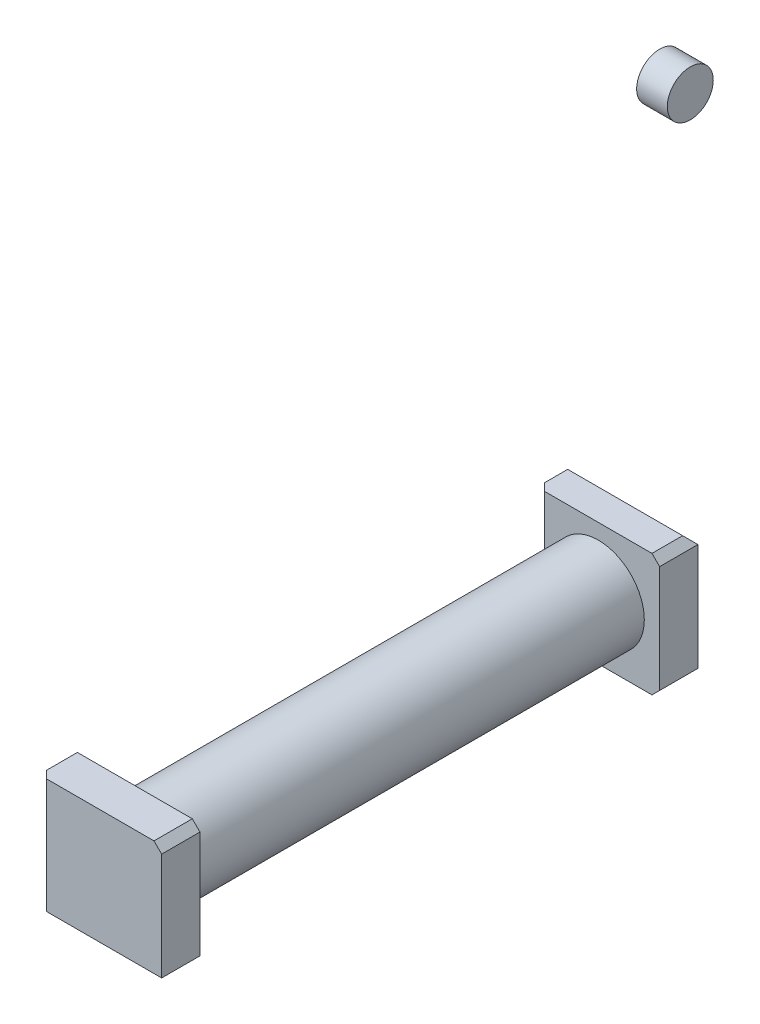
ISO-10303-21;
HEADER;
FILE_DESCRIPTION(('STEP AP214'),'2;1');
FILE_NAME('part.step','',(''),(''),'','','');
FILE_SCHEMA(('AUTOMOTIVE_DESIGN { 1 0 10303 214 1 1 1 1 }'));
ENDSEC;
DATA;
#1=APPLICATION_CONTEXT('core data for automotive mechanical design processes');
#2=APPLICATION_PROTOCOL_DEFINITION('international standard','automotive_design',2000,#1);
#3=PRODUCT_CONTEXT('',#1,'mechanical');
#4=PRODUCT('Part','Part','',(#3));
#5=PRODUCT_RELATED_PRODUCT_CATEGORY('part','',(#4));
#6=PRODUCT_DEFINITION_FORMATION('','',#4);
#7=PRODUCT_DEFINITION_CONTEXT('part definition',#1,'design');
#8=PRODUCT_DEFINITION('design','',#6,#7);
#9=PRODUCT_DEFINITION_SHAPE('','',#8);
#10=(LENGTH_UNIT() NAMED_UNIT(*) SI_UNIT(.MILLI.,.METRE.));
#11=(NAMED_UNIT(*) PLANE_ANGLE_UNIT() SI_UNIT($,.RADIAN.));
#12=(NAMED_UNIT(*) SI_UNIT($,.STERADIAN.) SOLID_ANGLE_UNIT());
#13=UNCERTAINTY_MEASURE_WITH_UNIT(LENGTH_MEASURE(1.E-05),#10,'distance_accuracy_value','');
#14=(GEOMETRIC_REPRESENTATION_CONTEXT(3) GLOBAL_UNCERTAINTY_ASSIGNED_CONTEXT((#13)) GLOBAL_UNIT_ASSIGNED_CONTEXT((#10,
#11,#12)) REPRESENTATION_CONTEXT('',''));
#15=CARTESIAN_POINT('',(0.,0.,0.));
#16=DIRECTION('',(0.,0.,1.));
#17=DIRECTION('',(1.,0.,0.));
#18=AXIS2_PLACEMENT_3D('',#15,#16,#17);
#19=CARTESIAN_POINT('',(60.,312.5,0.));
#20=DIRECTION('',(-1.,0.,0.));
#21=DIRECTION('',(0.,0.,1.));
#22=AXIS2_PLACEMENT_3D('',#19,#20,#21);
#23=CYLINDRICAL_SURFACE('',#22,15.);
#24=CARTESIAN_POINT('',(60.,312.5,0.));
#25=DIRECTION('',(1.,0.,0.));
#26=DIRECTION('',(0.,0.,-1.));
#27=AXIS2_PLACEMENT_3D('',#24,#25,#26);
#28=CIRCLE('',#27,15.);
#29=CARTESIAN_POINT('',(60.,312.5,-15.));
#30=VERTEX_POINT('',#29);
#31=EDGE_CURVE('E11',#30,#30,#28,.T.);
#32=ORIENTED_EDGE('',*,*,#31,.F.);
#33=EDGE_LOOP('',(#32));
#34=FACE_BOUND('',#33,.T.);
#35=CARTESIAN_POINT('',(40.,312.5,0.));
#36=DIRECTION('',(1.,0.,0.));
#37=DIRECTION('',(0.,0.,-1.));
#38=AXIS2_PLACEMENT_3D('',#35,#36,#37);
#39=CIRCLE('',#38,15.);
#40=CARTESIAN_POINT('',(40.,312.5,-15.));
#41=VERTEX_POINT('',#40);
#42=EDGE_CURVE('E55',#41,#41,#39,.T.);
#43=ORIENTED_EDGE('',*,*,#42,.T.);
#44=EDGE_LOOP('',(#43));
#45=FACE_BOUND('',#44,.T.);
#46=ADVANCED_FACE('F47',(#34,#45),#23,.T.);
#47=CARTESIAN_POINT('',(60.,312.5,0.));
#48=DIRECTION('',(1.,0.,0.));
#49=DIRECTION('',(0.,0.,-1.));
#50=AXIS2_PLACEMENT_3D('',#47,#48,#49);
#51=PLANE('',#50);
#52=ORIENTED_EDGE('',*,*,#31,.T.);
#53=EDGE_LOOP('',(#52));
#54=FACE_BOUND('',#53,.T.);
#55=ADVANCED_FACE('F63',(#54),#51,.T.);
#56=CARTESIAN_POINT('',(40.,312.5,0.));
#57=DIRECTION('',(1.,0.,0.));
#58=DIRECTION('',(0.,0.,-1.));
#59=AXIS2_PLACEMENT_3D('',#56,#57,#58);
#60=PLANE('',#59);
#61=ORIENTED_EDGE('',*,*,#42,.F.);
#62=EDGE_LOOP('',(#61));
#63=FACE_BOUND('',#62,.T.);
#64=ADVANCED_FACE('F62',(#63),#60,.F.);
#65=CLOSED_SHELL('',(#46,#55,#64));
#66=MANIFOLD_SOLID_BREP('B2',#65);
#67=CARTESIAN_POINT('',(0.,0.,300.));
#68=DIRECTION('',(0.,0.,-1.));
#69=DIRECTION('',(-1.,0.,0.));
#70=AXIS2_PLACEMENT_3D('',#67,#68,#69);
#71=CYLINDRICAL_SURFACE('',#70,30.);
#72=CARTESIAN_POINT('',(0.,0.,300.));
#73=DIRECTION('',(0.,0.,1.));
#74=DIRECTION('',(1.,0.,0.));
#75=AXIS2_PLACEMENT_3D('',#72,#73,#74);
#76=CIRCLE('',#75,30.);
#77=CARTESIAN_POINT('',(30.,0.,300.));
#78=VERTEX_POINT('',#77);
#79=EDGE_CURVE('E255',#78,#78,#76,.T.);
#80=ORIENTED_EDGE('',*,*,#79,.F.);
#81=EDGE_LOOP('',(#80));
#82=FACE_BOUND('',#81,.T.);
#83=CARTESIAN_POINT('',(0.,0.,0.));
#84=DIRECTION('',(0.,0.,1.));
#85=DIRECTION('',(1.,0.,0.));
#86=AXIS2_PLACEMENT_3D('',#83,#84,#85);
#87=CIRCLE('',#86,30.);
#88=CARTESIAN_POINT('',(30.,0.,0.));
#89=VERTEX_POINT('',#88);
#90=EDGE_CURVE('E253',#89,#89,#87,.T.);
#91=ORIENTED_EDGE('',*,*,#90,.T.);
#92=EDGE_LOOP('',(#91));
#93=FACE_BOUND('',#92,.T.);
#94=ADVANCED_FACE('F89',(#82,#93),#71,.T.);
#95=CARTESIAN_POINT('',(40.,-40.,-25.));
#96=DIRECTION('',(1.,0.,0.));
#97=DIRECTION('',(0.,0.,-1.));
#98=AXIS2_PLACEMENT_3D('',#95,#96,#97);
#99=PLANE('',#98);
#100=DIRECTION('',(0.,1.,0.));
#101=VECTOR('',#100,1.);
#102=CARTESIAN_POINT('',(40.,-40.,0.));
#103=LINE('',#102,#101);
#104=CARTESIAN_POINT('',(40.,-35.,0.));
#105=VERTEX_POINT('',#104);
#106=CARTESIAN_POINT('',(40.,35.0000000000001,0.));
#107=VERTEX_POINT('',#106);
#108=EDGE_CURVE('E238',#105,#107,#103,.T.);
#109=ORIENTED_EDGE('',*,*,#108,.F.);
#110=DIRECTION('',(0.,0.,-1.));
#111=VECTOR('',#110,1.);
#112=CARTESIAN_POINT('',(40.,-35.,-25.));
#113=LINE('',#112,#111);
#114=CARTESIAN_POINT('',(40.,-35.,-25.));
#115=VERTEX_POINT('',#114);
#116=EDGE_CURVE('E274',#105,#115,#113,.T.);
#117=ORIENTED_EDGE('',*,*,#116,.T.);
#118=DIRECTION('',(0.,1.,0.));
#119=VECTOR('',#118,1.);
#120=CARTESIAN_POINT('',(40.,-40.,-25.));
#121=LINE('',#120,#119);
#122=CARTESIAN_POINT('',(40.,35.0000000000001,-25.));
#123=VERTEX_POINT('',#122);
#124=EDGE_CURVE('E230',#115,#123,#121,.T.);
#125=ORIENTED_EDGE('',*,*,#124,.T.);
#126=DIRECTION('',(0.,0.,1.));
#127=VECTOR('',#126,1.);
#128=CARTESIAN_POINT('',(40.,35.0000000000001,-25.));
#129=LINE('',#128,#127);
#130=EDGE_CURVE('E272',#123,#107,#129,.T.);
#131=ORIENTED_EDGE('',*,*,#130,.T.);
#132=EDGE_LOOP('',(#109,#117,#125,#131));
#133=FACE_BOUND('',#132,.T.);
#134=ADVANCED_FACE('F343',(#133),#99,.T.);
#135=CARTESIAN_POINT('',(-40.,-40.,-25.));
#136=DIRECTION('',(0.,-1.,0.));
#137=DIRECTION('',(0.,0.,-1.));
#138=AXIS2_PLACEMENT_3D('',#135,#136,#137);
#139=PLANE('',#138);
#140=DIRECTION('',(1.,0.,0.));
#141=VECTOR('',#140,1.);
#142=CARTESIAN_POINT('',(-40.,-40.,-25.));
#143=LINE('',#142,#141);
#144=CARTESIAN_POINT('',(-40.,-40.,-25.));
#145=VERTEX_POINT('',#144);
#146=CARTESIAN_POINT('',(35.0000000000001,-40.,-25.));
#147=VERTEX_POINT('',#146);
#148=EDGE_CURVE('E237',#145,#147,#143,.T.);
#149=ORIENTED_EDGE('',*,*,#148,.T.);
#150=DIRECTION('',(0.,0.,1.));
#151=VECTOR('',#150,1.);
#152=CARTESIAN_POINT('',(35.0000000000001,-40.,-25.));
#153=LINE('',#152,#151);
#154=CARTESIAN_POINT('',(35.0000000000001,-40.,0.));
#155=VERTEX_POINT('',#154);
#156=EDGE_CURVE('E263',#147,#155,#153,.T.);
#157=ORIENTED_EDGE('',*,*,#156,.T.);
#158=DIRECTION('',(1.,0.,0.));
#159=VECTOR('',#158,1.);
#160=CARTESIAN_POINT('',(-40.,-40.,0.));
#161=LINE('',#160,#159);
#162=CARTESIAN_POINT('',(-35.0000000000001,-40.,0.));
#163=VERTEX_POINT('',#162);
#164=EDGE_CURVE('E231',#163,#155,#161,.T.);
#165=ORIENTED_EDGE('',*,*,#164,.F.);
#166=DIRECTION('',(-0.70710678118654,0.,-0.707106781186555));
#167=VECTOR('',#166,1.);
#168=CARTESIAN_POINT('',(-50.,-40.,-15.0000000000002));
#169=LINE('',#168,#167);
#170=CARTESIAN_POINT('',(-40.,-40.,-5.));
#171=VERTEX_POINT('',#170);
#172=EDGE_CURVE('E260',#163,#171,#169,.T.);
#173=ORIENTED_EDGE('',*,*,#172,.T.);
#174=DIRECTION('',(0.,0.,1.));
#175=VECTOR('',#174,1.);
#176=CARTESIAN_POINT('',(-40.,-40.,-25.));
#177=LINE('',#176,#175);
#178=EDGE_CURVE('E249',#145,#171,#177,.T.);
#179=ORIENTED_EDGE('',*,*,#178,.F.);
#180=EDGE_LOOP('',(#149,#157,#165,#173,#179));
#181=FACE_BOUND('',#180,.T.);
#182=ADVANCED_FACE('F352',(#181),#139,.T.);
#183=CARTESIAN_POINT('',(-40.,-40.,-25.));
#184=DIRECTION('',(-1.,0.,0.));
#185=DIRECTION('',(0.,0.,1.));
#186=AXIS2_PLACEMENT_3D('',#183,#184,#185);
#187=PLANE('',#186);
#188=ORIENTED_EDGE('',*,*,#178,.T.);
#189=DIRECTION('',(0.,1.,0.));
#190=VECTOR('',#189,1.);
#191=CARTESIAN_POINT('',(-40.,40.,-5.));
#192=LINE('',#191,#190);
#193=CARTESIAN_POINT('',(-40.,40.,-5.));
#194=VERTEX_POINT('',#193);
#195=EDGE_CURVE('E284',#171,#194,#192,.T.);
#196=ORIENTED_EDGE('',*,*,#195,.T.);
#197=DIRECTION('',(0.,0.,1.));
#198=VECTOR('',#197,1.);
#199=CARTESIAN_POINT('',(-40.,40.,-25.));
#200=LINE('',#199,#198);
#201=CARTESIAN_POINT('',(-40.,40.,-20.));
#202=VERTEX_POINT('',#201);
#203=EDGE_CURVE('E239',#202,#194,#200,.T.);
#204=ORIENTED_EDGE('',*,*,#203,.F.);
#205=DIRECTION('',(0.,0.70710678118654,0.707106781186555));
#206=VECTOR('',#205,1.);
#207=CARTESIAN_POINT('',(-40.,-2.49999999999911,-62.5000000000001));
#208=LINE('',#207,#206);
#209=CARTESIAN_POINT('',(-40.,35.0000000000001,-25.));
#210=VERTEX_POINT('',#209);
#211=EDGE_CURVE('E281',#202,#210,#208,.F.);
#212=ORIENTED_EDGE('',*,*,#211,.T.);
#213=DIRECTION('',(0.,-1.,0.));
#214=VECTOR('',#213,1.);
#215=CARTESIAN_POINT('',(-40.,-40.,-25.));
#216=LINE('',#215,#214);
#217=EDGE_CURVE('E235',#210,#145,#216,.T.);
#218=ORIENTED_EDGE('',*,*,#217,.T.);
#219=EDGE_LOOP('',(#188,#196,#204,#212,#218));
#220=FACE_BOUND('',#219,.T.);
#221=ADVANCED_FACE('F527',(#220),#187,.T.);
#222=CARTESIAN_POINT('',(-40.,40.,-25.));
#223=DIRECTION('',(0.,1.,0.));
#224=DIRECTION('',(0.,0.,1.));
#225=AXIS2_PLACEMENT_3D('',#222,#223,#224);
#226=PLANE('',#225);
#227=ORIENTED_EDGE('',*,*,#203,.T.);
#228=DIRECTION('',(0.70710678118654,0.,0.707106781186555));
#229=VECTOR('',#228,1.);
#230=CARTESIAN_POINT('',(-50.,40.,-15.0000000000002));
#231=LINE('',#230,#229);
#232=CARTESIAN_POINT('',(-35.0000000000001,40.,0.));
#233=VERTEX_POINT('',#232);
#234=EDGE_CURVE('E288',#194,#233,#231,.T.);
#235=ORIENTED_EDGE('',*,*,#234,.T.);
#236=DIRECTION('',(-1.,0.,0.));
#237=VECTOR('',#236,1.);
#238=CARTESIAN_POINT('',(-40.,40.,0.));
#239=LINE('',#238,#237);
#240=CARTESIAN_POINT('',(35.,40.,0.));
#241=VERTEX_POINT('',#240);
#242=EDGE_CURVE('E244',#241,#233,#239,.T.);
#243=ORIENTED_EDGE('',*,*,#242,.F.);
#244=DIRECTION('',(0.,0.,-1.));
#245=VECTOR('',#244,1.);
#246=CARTESIAN_POINT('',(35.,40.,-25.));
#247=LINE('',#246,#245);
#248=CARTESIAN_POINT('',(35.,40.,-20.));
#249=VERTEX_POINT('',#248);
#250=EDGE_CURVE('E285',#241,#249,#247,.T.);
#251=ORIENTED_EDGE('',*,*,#250,.T.);
#252=DIRECTION('',(-1.,0.,0.));
#253=VECTOR('',#252,1.);
#254=CARTESIAN_POINT('',(-40.,40.,-20.));
#255=LINE('',#254,#253);
#256=EDGE_CURVE('E289',#249,#202,#255,.T.);
#257=ORIENTED_EDGE('',*,*,#256,.T.);
#258=EDGE_LOOP('',(#227,#235,#243,#251,#257));
#259=FACE_BOUND('',#258,.T.);
#260=ADVANCED_FACE('F519',(#259),#226,.T.);
#261=CARTESIAN_POINT('',(0.,0.,-25.));
#262=DIRECTION('',(0.,0.,-1.));
#263=DIRECTION('',(-1.,0.,0.));
#264=AXIS2_PLACEMENT_3D('',#261,#262,#263);
#265=PLANE('',#264);
#266=CARTESIAN_POINT('',(0.,0.,-25.));
#267=DIRECTION('',(0.,0.,-1.));
#268=DIRECTION('',(-1.,0.,0.));
#269=AXIS2_PLACEMENT_3D('',#266,#267,#268);
#270=CIRCLE('',#269,21.);
#271=CARTESIAN_POINT('',(-21.,0.,-25.));
#272=VERTEX_POINT('',#271);
#273=EDGE_CURVE('E228',#272,#272,#270,.T.);
#274=ORIENTED_EDGE('',*,*,#273,.F.);
#275=EDGE_LOOP('',(#274));
#276=FACE_BOUND('',#275,.T.);
#277=ORIENTED_EDGE('',*,*,#124,.F.);
#278=DIRECTION('',(0.70710678118654,0.707106781186555,0.));
#279=VECTOR('',#278,1.);
#280=CARTESIAN_POINT('',(37.5000000000004,-37.4999999999996,-25.));
#281=LINE('',#280,#279);
#282=EDGE_CURVE('E276',#115,#147,#281,.F.);
#283=ORIENTED_EDGE('',*,*,#282,.T.);
#284=ORIENTED_EDGE('',*,*,#148,.F.);
#285=ORIENTED_EDGE('',*,*,#217,.F.);
#286=DIRECTION('',(1.,0.,0.));
#287=VECTOR('',#286,1.);
#288=CARTESIAN_POINT('',(0.,35.0000000000001,-25.));
#289=LINE('',#288,#287);
#290=EDGE_CURVE('E280',#210,#123,#289,.T.);
#291=ORIENTED_EDGE('',*,*,#290,.T.);
#292=EDGE_LOOP('',(#277,#283,#284,#285,#291));
#293=FACE_BOUND('',#292,.T.);
#294=ADVANCED_FACE('F506',(#276,#293),#265,.T.);
#295=CARTESIAN_POINT('',(0.,0.,0.));
#296=DIRECTION('',(0.,0.,-1.));
#297=DIRECTION('',(-1.,0.,0.));
#298=AXIS2_PLACEMENT_3D('',#295,#296,#297);
#299=PLANE('',#298);
#300=ORIENTED_EDGE('',*,*,#90,.F.);
#301=EDGE_LOOP('',(#300));
#302=FACE_BOUND('',#301,.T.);
#303=ORIENTED_EDGE('',*,*,#164,.T.);
#304=DIRECTION('',(-0.70710678118654,-0.707106781186555,0.));
#305=VECTOR('',#304,1.);
#306=CARTESIAN_POINT('',(35.0000000000001,-40.,0.));
#307=LINE('',#306,#305);
#308=EDGE_CURVE('E271',#155,#105,#307,.F.);
#309=ORIENTED_EDGE('',*,*,#308,.T.);
#310=ORIENTED_EDGE('',*,*,#108,.T.);
#311=DIRECTION('',(0.707106781186555,-0.70710678118654,0.));
#312=VECTOR('',#311,1.);
#313=CARTESIAN_POINT('',(40.,35.0000000000001,0.));
#314=LINE('',#313,#312);
#315=EDGE_CURVE('E266',#107,#241,#314,.F.);
#316=ORIENTED_EDGE('',*,*,#315,.T.);
#317=ORIENTED_EDGE('',*,*,#242,.T.);
#318=DIRECTION('',(0.,-1.,0.));
#319=VECTOR('',#318,1.);
#320=CARTESIAN_POINT('',(-35.0000000000001,-40.,0.));
#321=LINE('',#320,#319);
#322=EDGE_CURVE('E268',#233,#163,#321,.T.);
#323=ORIENTED_EDGE('',*,*,#322,.T.);
#324=EDGE_LOOP('',(#303,#309,#310,#316,#317,#323));
#325=FACE_BOUND('',#324,.T.);
#326=ADVANCED_FACE('F498',(#302,#325),#299,.F.);
#327=CARTESIAN_POINT('',(0.,0.,-30.));
#328=DIRECTION('',(0.,0.,1.));
#329=DIRECTION('',(1.,0.,0.));
#330=AXIS2_PLACEMENT_3D('',#327,#328,#329);
#331=CYLINDRICAL_SURFACE('',#330,21.);
#332=ORIENTED_EDGE('',*,*,#273,.T.);
#333=EDGE_LOOP('',(#332));
#334=FACE_BOUND('',#333,.T.);
#335=CARTESIAN_POINT('',(0.,0.,0.));
#336=DIRECTION('',(0.,0.,1.));
#337=DIRECTION('',(1.,0.,0.));
#338=AXIS2_PLACEMENT_3D('',#335,#336,#337);
#339=CIRCLE('',#338,21.);
#340=CARTESIAN_POINT('',(21.,0.,0.));
#341=VERTEX_POINT('',#340);
#342=EDGE_CURVE('E204',#341,#341,#339,.T.);
#343=ORIENTED_EDGE('',*,*,#342,.T.);
#344=EDGE_LOOP('',(#343));
#345=FACE_BOUND('',#344,.T.);
#346=ADVANCED_FACE('F495',(#334,#345),#331,.F.);
#347=CARTESIAN_POINT('',(0.,0.,0.));
#348=DIRECTION('',(0.,0.,1.));
#349=DIRECTION('',(1.,0.,0.));
#350=AXIS2_PLACEMENT_3D('',#347,#348,#349);
#351=PLANE('',#350);
#352=ORIENTED_EDGE('',*,*,#342,.F.);
#353=EDGE_LOOP('',(#352));
#354=FACE_BOUND('',#353,.T.);
#355=ADVANCED_FACE('F482',(#354),#351,.F.);
#356=CARTESIAN_POINT('',(40.,-40.,325.));
#357=DIRECTION('',(-1.,0.,0.));
#358=DIRECTION('',(0.,0.,1.));
#359=AXIS2_PLACEMENT_3D('',#356,#357,#358);
#360=PLANE('',#359);
#361=DIRECTION('',(0.,1.,0.));
#362=VECTOR('',#361,1.);
#363=CARTESIAN_POINT('',(40.,-40.,325.));
#364=LINE('',#363,#362);
#365=CARTESIAN_POINT('',(40.,-35.0000000000001,325.));
#366=VERTEX_POINT('',#365);
#367=CARTESIAN_POINT('',(40.,35.,325.));
#368=VERTEX_POINT('',#367);
#369=EDGE_CURVE('E222',#366,#368,#364,.T.);
#370=ORIENTED_EDGE('',*,*,#369,.F.);
#371=DIRECTION('',(0.,0.,-1.));
#372=VECTOR('',#371,1.);
#373=CARTESIAN_POINT('',(40.,-35.0000000000001,325.));
#374=LINE('',#373,#372);
#375=CARTESIAN_POINT('',(40.,-35.0000000000001,300.));
#376=VERTEX_POINT('',#375);
#377=EDGE_CURVE('E297',#366,#376,#374,.T.);
#378=ORIENTED_EDGE('',*,*,#377,.T.);
#379=DIRECTION('',(0.,1.,0.));
#380=VECTOR('',#379,1.);
#381=CARTESIAN_POINT('',(40.,-40.,300.));
#382=LINE('',#381,#380);
#383=CARTESIAN_POINT('',(40.,35.,300.));
#384=VERTEX_POINT('',#383);
#385=EDGE_CURVE('E212',#376,#384,#382,.T.);
#386=ORIENTED_EDGE('',*,*,#385,.T.);
#387=DIRECTION('',(0.,0.,1.));
#388=VECTOR('',#387,1.);
#389=CARTESIAN_POINT('',(40.,35.,325.));
#390=LINE('',#389,#388);
#391=EDGE_CURVE('E295',#384,#368,#390,.T.);
#392=ORIENTED_EDGE('',*,*,#391,.T.);
#393=EDGE_LOOP('',(#370,#378,#386,#392));
#394=FACE_BOUND('',#393,.T.);
#395=ADVANCED_FACE('F336',(#394),#360,.F.);
#396=CARTESIAN_POINT('',(-40.,40.,325.));
#397=DIRECTION('',(0.,-1.,0.));
#398=DIRECTION('',(0.,0.,-1.));
#399=AXIS2_PLACEMENT_3D('',#396,#397,#398);
#400=PLANE('',#399);
#401=DIRECTION('',(0.,0.,-1.));
#402=VECTOR('',#401,1.);
#403=CARTESIAN_POINT('',(-40.,40.,325.));
#404=LINE('',#403,#402);
#405=CARTESIAN_POINT('',(-40.,40.,320.));
#406=VERTEX_POINT('',#405);
#407=CARTESIAN_POINT('',(-40.,40.,300.));
#408=VERTEX_POINT('',#407);
#409=EDGE_CURVE('E198',#406,#408,#404,.T.);
#410=ORIENTED_EDGE('',*,*,#409,.F.);
#411=DIRECTION('',(-0.70710678118654,0.,-0.707106781186555));
#412=VECTOR('',#411,1.);
#413=CARTESIAN_POINT('',(-35.0000000000001,40.,325.));
#414=LINE('',#413,#412);
#415=CARTESIAN_POINT('',(-35.0000000000001,40.,325.));
#416=VERTEX_POINT('',#415);
#417=EDGE_CURVE('E50',#406,#416,#414,.F.);
#418=ORIENTED_EDGE('',*,*,#417,.T.);
#419=DIRECTION('',(-1.,0.,0.));
#420=VECTOR('',#419,1.);
#421=CARTESIAN_POINT('',(-40.,40.,325.));
#422=LINE('',#421,#420);
#423=CARTESIAN_POINT('',(35.0000000000001,40.,325.));
#424=VERTEX_POINT('',#423);
#425=EDGE_CURVE('E223',#424,#416,#422,.T.);
#426=ORIENTED_EDGE('',*,*,#425,.F.);
#427=DIRECTION('',(0.,0.,-1.));
#428=VECTOR('',#427,1.);
#429=CARTESIAN_POINT('',(35.0000000000001,40.,325.));
#430=LINE('',#429,#428);
#431=CARTESIAN_POINT('',(35.0000000000001,40.,300.));
#432=VERTEX_POINT('',#431);
#433=EDGE_CURVE('E99',#424,#432,#430,.T.);
#434=ORIENTED_EDGE('',*,*,#433,.T.);
#435=DIRECTION('',(-1.,0.,0.));
#436=VECTOR('',#435,1.);
#437=CARTESIAN_POINT('',(-40.,40.,300.));
#438=LINE('',#437,#436);
#439=EDGE_CURVE('E207',#432,#408,#438,.T.);
#440=ORIENTED_EDGE('',*,*,#439,.T.);
#441=EDGE_LOOP('',(#410,#418,#426,#434,#440));
#442=FACE_BOUND('',#441,.T.);
#443=ADVANCED_FACE('F209',(#442),#400,.F.);
#444=CARTESIAN_POINT('',(-40.,-40.,325.));
#445=DIRECTION('',(1.,0.,0.));
#446=DIRECTION('',(0.,0.,-1.));
#447=AXIS2_PLACEMENT_3D('',#444,#445,#446);
#448=PLANE('',#447);
#449=DIRECTION('',(0.,0.,-1.));
#450=VECTOR('',#449,1.);
#451=CARTESIAN_POINT('',(-40.,-40.,325.));
#452=LINE('',#451,#450);
#453=CARTESIAN_POINT('',(-40.,-40.,320.));
#454=VERTEX_POINT('',#453);
#455=CARTESIAN_POINT('',(-40.,-40.,300.));
#456=VERTEX_POINT('',#455);
#457=EDGE_CURVE('E202',#454,#456,#452,.T.);
#458=ORIENTED_EDGE('',*,*,#457,.F.);
#459=DIRECTION('',(0.,1.,0.));
#460=VECTOR('',#459,1.);
#461=CARTESIAN_POINT('',(-40.,-40.,320.));
#462=LINE('',#461,#460);
#463=EDGE_CURVE('E107',#454,#406,#462,.T.);
#464=ORIENTED_EDGE('',*,*,#463,.T.);
#465=ORIENTED_EDGE('',*,*,#409,.T.);
#466=DIRECTION('',(0.,-1.,0.));
#467=VECTOR('',#466,1.);
#468=CARTESIAN_POINT('',(-40.,-40.,300.));
#469=LINE('',#468,#467);
#470=EDGE_CURVE('E199',#408,#456,#469,.T.);
#471=ORIENTED_EDGE('',*,*,#470,.T.);
#472=EDGE_LOOP('',(#458,#464,#465,#471));
#473=FACE_BOUND('',#472,.T.);
#474=ADVANCED_FACE('F196',(#473),#448,.F.);
#475=CARTESIAN_POINT('',(-40.,-40.,325.));
#476=DIRECTION('',(0.,1.,0.));
#477=DIRECTION('',(0.,0.,1.));
#478=AXIS2_PLACEMENT_3D('',#475,#476,#477);
#479=PLANE('',#478);
#480=DIRECTION('',(1.,0.,0.));
#481=VECTOR('',#480,1.);
#482=CARTESIAN_POINT('',(-40.,-40.,300.));
#483=LINE('',#482,#481);
#484=CARTESIAN_POINT('',(35.,-40.,300.));
#485=VERTEX_POINT('',#484);
#486=EDGE_CURVE('E218',#456,#485,#483,.T.);
#487=ORIENTED_EDGE('',*,*,#486,.T.);
#488=DIRECTION('',(0.,0.,1.));
#489=VECTOR('',#488,1.);
#490=CARTESIAN_POINT('',(35.,-40.,325.));
#491=LINE('',#490,#489);
#492=CARTESIAN_POINT('',(35.,-40.,320.));
#493=VERTEX_POINT('',#492);
#494=EDGE_CURVE('E308',#485,#493,#491,.T.);
#495=ORIENTED_EDGE('',*,*,#494,.T.);
#496=DIRECTION('',(-1.,0.,0.));
#497=VECTOR('',#496,1.);
#498=CARTESIAN_POINT('',(-40.,-40.,320.));
#499=LINE('',#498,#497);
#500=EDGE_CURVE('E303',#493,#454,#499,.T.);
#501=ORIENTED_EDGE('',*,*,#500,.T.);
#502=ORIENTED_EDGE('',*,*,#457,.T.);
#503=EDGE_LOOP('',(#487,#495,#501,#502));
#504=FACE_BOUND('',#503,.T.);
#505=ADVANCED_FACE('F451',(#504),#479,.F.);
#506=CARTESIAN_POINT('',(0.,0.,325.));
#507=DIRECTION('',(0.,0.,-1.));
#508=DIRECTION('',(-1.,0.,0.));
#509=AXIS2_PLACEMENT_3D('',#506,#507,#508);
#510=PLANE('',#509);
#511=DIRECTION('',(0.,-1.,0.));
#512=VECTOR('',#511,1.);
#513=CARTESIAN_POINT('',(-35.0000000000001,0.,325.));
#514=LINE('',#513,#512);
#515=CARTESIAN_POINT('',(-35.0000000000001,-35.0000000000001,325.));
#516=VERTEX_POINT('',#515);
#517=EDGE_CURVE('E116',#416,#516,#514,.T.);
#518=ORIENTED_EDGE('',*,*,#517,.T.);
#519=DIRECTION('',(1.,0.,0.));
#520=VECTOR('',#519,1.);
#521=CARTESIAN_POINT('',(0.,-35.0000000000001,325.));
#522=LINE('',#521,#520);
#523=EDGE_CURVE('E313',#516,#366,#522,.T.);
#524=ORIENTED_EDGE('',*,*,#523,.T.);
#525=ORIENTED_EDGE('',*,*,#369,.T.);
#526=DIRECTION('',(0.70710678118654,-0.707106781186555,0.));
#527=VECTOR('',#526,1.);
#528=CARTESIAN_POINT('',(35.0000000000001,40.,325.));
#529=LINE('',#528,#527);
#530=EDGE_CURVE('E306',#368,#424,#529,.F.);
#531=ORIENTED_EDGE('',*,*,#530,.T.);
#532=ORIENTED_EDGE('',*,*,#425,.T.);
#533=EDGE_LOOP('',(#518,#524,#525,#531,#532));
#534=FACE_BOUND('',#533,.T.);
#535=ADVANCED_FACE('F330',(#534),#510,.F.);
#536=CARTESIAN_POINT('',(0.,0.,300.));
#537=DIRECTION('',(0.,0.,-1.));
#538=DIRECTION('',(-1.,0.,0.));
#539=AXIS2_PLACEMENT_3D('',#536,#537,#538);
#540=PLANE('',#539);
#541=ORIENTED_EDGE('',*,*,#79,.T.);
#542=EDGE_LOOP('',(#541));
#543=FACE_BOUND('',#542,.T.);
#544=ORIENTED_EDGE('',*,*,#385,.F.);
#545=DIRECTION('',(0.707106781186555,0.70710678118654,0.));
#546=VECTOR('',#545,1.);
#547=CARTESIAN_POINT('',(37.4999999999996,-37.5000000000004,300.));
#548=LINE('',#547,#546);
#549=EDGE_CURVE('E302',#376,#485,#548,.F.);
#550=ORIENTED_EDGE('',*,*,#549,.T.);
#551=ORIENTED_EDGE('',*,*,#486,.F.);
#552=ORIENTED_EDGE('',*,*,#470,.F.);
#553=ORIENTED_EDGE('',*,*,#439,.F.);
#554=DIRECTION('',(-0.70710678118654,0.707106781186555,0.));
#555=VECTOR('',#554,1.);
#556=CARTESIAN_POINT('',(37.5000000000004,37.4999999999996,300.));
#557=LINE('',#556,#555);
#558=EDGE_CURVE('E300',#432,#384,#557,.F.);
#559=ORIENTED_EDGE('',*,*,#558,.T.);
#560=EDGE_LOOP('',(#544,#550,#551,#552,#553,#559));
#561=FACE_BOUND('',#560,.T.);
#562=ADVANCED_FACE('F220',(#543,#561),#540,.T.);
#563=CARTESIAN_POINT('',(35.0000000000001,-40.,-25.));
#564=DIRECTION('',(-0.707106781186555,0.70710678118654,0.));
#565=DIRECTION('',(0.,0.,1.));
#566=AXIS2_PLACEMENT_3D('',#563,#564,#565);
#567=PLANE('',#566);
#568=ORIENTED_EDGE('',*,*,#282,.F.);
#569=ORIENTED_EDGE('',*,*,#116,.F.);
#570=ORIENTED_EDGE('',*,*,#308,.F.);
#571=ORIENTED_EDGE('',*,*,#156,.F.);
#572=EDGE_LOOP('',(#568,#569,#570,#571));
#573=FACE_BOUND('',#572,.T.);
#574=ADVANCED_FACE('F360',(#573),#567,.F.);
#575=CARTESIAN_POINT('',(-35.0000000000001,0.,0.));
#576=DIRECTION('',(-0.707106781186555,0.,0.70710678118654));
#577=DIRECTION('',(0.,1.,0.));
#578=AXIS2_PLACEMENT_3D('',#575,#576,#577);
#579=PLANE('',#578);
#580=ORIENTED_EDGE('',*,*,#234,.F.);
#581=ORIENTED_EDGE('',*,*,#195,.F.);
#582=ORIENTED_EDGE('',*,*,#172,.F.);
#583=ORIENTED_EDGE('',*,*,#322,.F.);
#584=EDGE_LOOP('',(#580,#581,#582,#583));
#585=FACE_BOUND('',#584,.T.);
#586=ADVANCED_FACE('F368',(#585),#579,.T.);
#587=CARTESIAN_POINT('',(40.,35.0000000000001,-25.));
#588=DIRECTION('',(-0.70710678118654,-0.707106781186555,0.));
#589=DIRECTION('',(0.,0.,1.));
#590=AXIS2_PLACEMENT_3D('',#587,#588,#589);
#591=PLANE('',#590);
#592=ORIENTED_EDGE('',*,*,#315,.F.);
#593=ORIENTED_EDGE('',*,*,#130,.F.);
#594=DIRECTION('',(-0.57735026918963,0.577350269189617,0.57735026918963));
#595=VECTOR('',#594,1.);
#596=CARTESIAN_POINT('',(40.,35.0000000000001,-25.));
#597=LINE('',#596,#595);
#598=EDGE_CURVE('E291',#249,#123,#597,.F.);
#599=ORIENTED_EDGE('',*,*,#598,.F.);
#600=ORIENTED_EDGE('',*,*,#250,.F.);
#601=EDGE_LOOP('',(#592,#593,#599,#600));
#602=FACE_BOUND('',#601,.T.);
#603=ADVANCED_FACE('F373',(#602),#591,.F.);
#604=CARTESIAN_POINT('',(-40.,40.,-20.));
#605=DIRECTION('',(0.,-0.707106781186555,0.70710678118654));
#606=DIRECTION('',(-1.,0.,0.));
#607=AXIS2_PLACEMENT_3D('',#604,#605,#606);
#608=PLANE('',#607);
#609=ORIENTED_EDGE('',*,*,#598,.T.);
#610=ORIENTED_EDGE('',*,*,#290,.F.);
#611=ORIENTED_EDGE('',*,*,#211,.F.);
#612=ORIENTED_EDGE('',*,*,#256,.F.);
#613=EDGE_LOOP('',(#609,#610,#611,#612));
#614=FACE_BOUND('',#613,.T.);
#615=ADVANCED_FACE('F376',(#614),#608,.F.);
#616=CARTESIAN_POINT('',(-35.0000000000001,0.,325.));
#617=DIRECTION('',(0.707106781186555,0.,-0.70710678118654));
#618=DIRECTION('',(0.,-1.,0.));
#619=AXIS2_PLACEMENT_3D('',#616,#617,#618);
#620=PLANE('',#619);
#621=ORIENTED_EDGE('',*,*,#417,.F.);
#622=ORIENTED_EDGE('',*,*,#463,.F.);
#623=DIRECTION('',(0.577350269189622,0.577350269189622,0.577350269189634));
#624=VECTOR('',#623,1.);
#625=CARTESIAN_POINT('',(-23.3333333333336,-23.3333333333336,336.666666666667));
#626=LINE('',#625,#624);
#627=EDGE_CURVE('E92',#516,#454,#626,.F.);
#628=ORIENTED_EDGE('',*,*,#627,.F.);
#629=ORIENTED_EDGE('',*,*,#517,.F.);
#630=EDGE_LOOP('',(#621,#622,#628,#629));
#631=FACE_BOUND('',#630,.T.);
#632=ADVANCED_FACE('F326',(#631),#620,.F.);
#633=CARTESIAN_POINT('',(0.,-35.0000000000001,325.));
#634=DIRECTION('',(0.,0.707106781186555,-0.70710678118654));
#635=DIRECTION('',(1.,0.,0.));
#636=AXIS2_PLACEMENT_3D('',#633,#634,#635);
#637=PLANE('',#636);
#638=ORIENTED_EDGE('',*,*,#627,.T.);
#639=ORIENTED_EDGE('',*,*,#500,.F.);
#640=DIRECTION('',(0.57735026918963,0.577350269189617,0.57735026918963));
#641=VECTOR('',#640,1.);
#642=CARTESIAN_POINT('',(26.6666666666665,-48.3333333333333,311.666666666666));
#643=LINE('',#642,#641);
#644=EDGE_CURVE('E314',#366,#493,#643,.F.);
#645=ORIENTED_EDGE('',*,*,#644,.F.);
#646=ORIENTED_EDGE('',*,*,#523,.F.);
#647=EDGE_LOOP('',(#638,#639,#645,#646));
#648=FACE_BOUND('',#647,.T.);
#649=ADVANCED_FACE('F322',(#648),#637,.F.);
#650=CARTESIAN_POINT('',(40.,-35.0000000000001,325.));
#651=DIRECTION('',(-0.70710678118654,0.707106781186555,0.));
#652=DIRECTION('',(0.,0.,-1.));
#653=AXIS2_PLACEMENT_3D('',#650,#651,#652);
#654=PLANE('',#653);
#655=ORIENTED_EDGE('',*,*,#644,.T.);
#656=ORIENTED_EDGE('',*,*,#494,.F.);
#657=ORIENTED_EDGE('',*,*,#549,.F.);
#658=ORIENTED_EDGE('',*,*,#377,.F.);
#659=EDGE_LOOP('',(#655,#656,#657,#658));
#660=FACE_BOUND('',#659,.T.);
#661=ADVANCED_FACE('F338',(#660),#654,.F.);
#662=CARTESIAN_POINT('',(35.0000000000001,40.,325.));
#663=DIRECTION('',(-0.707106781186555,-0.70710678118654,0.));
#664=DIRECTION('',(0.,0.,-1.));
#665=AXIS2_PLACEMENT_3D('',#662,#663,#664);
#666=PLANE('',#665);
#667=ORIENTED_EDGE('',*,*,#530,.F.);
#668=ORIENTED_EDGE('',*,*,#391,.F.);
#669=ORIENTED_EDGE('',*,*,#558,.F.);
#670=ORIENTED_EDGE('',*,*,#433,.F.);
#671=EDGE_LOOP('',(#667,#668,#669,#670));
#672=FACE_BOUND('',#671,.T.);
#673=ADVANCED_FACE('F91',(#672),#666,.F.);
#674=CLOSED_SHELL('',(#94,#134,#182,#221,#260,#294,#326,#346,#355,#395,#443,#474,#505,#535,#562,
#574,#586,#603,#615,#632,#649,#661,#673));
#675=MANIFOLD_SOLID_BREP('B6',#674);
#676=ADVANCED_BREP_SHAPE_REPRESENTATION('',(#18,#66,#675),#14);
#677=SHAPE_DEFINITION_REPRESENTATION(#9,#676);
ENDSEC;
END-ISO-10303-21;
